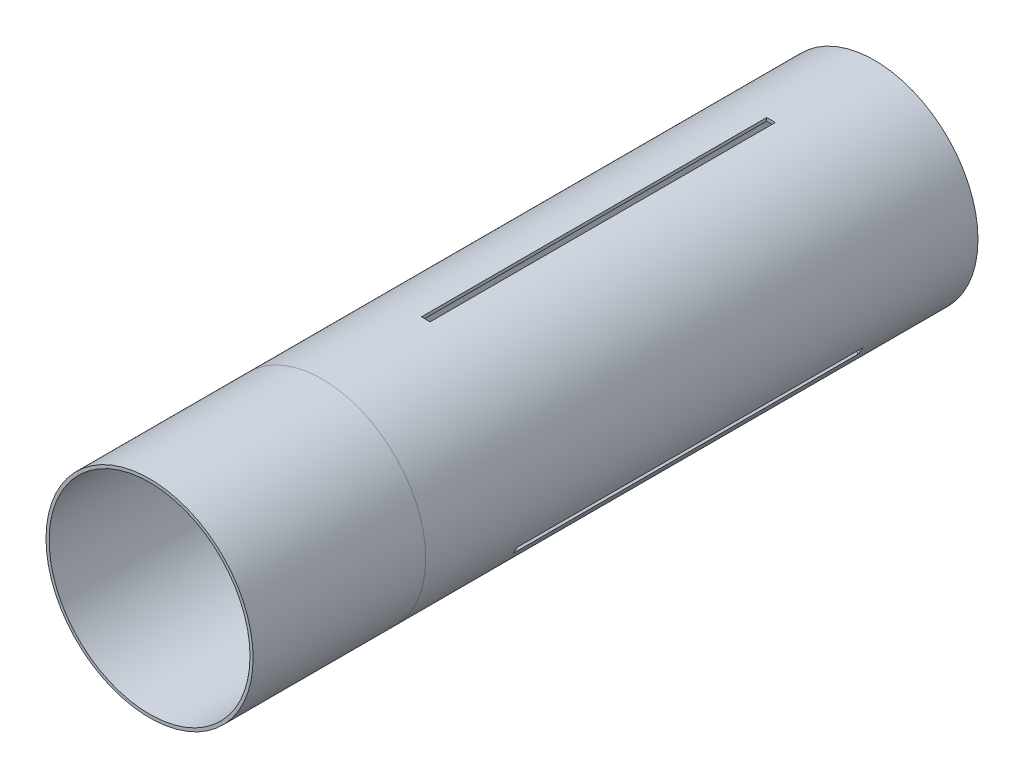
ISO-10303-21;
HEADER;
FILE_DESCRIPTION(('STEP AP214'),'2;1');
FILE_NAME('part.step','',(''),(''),'','','');
FILE_SCHEMA(('AUTOMOTIVE_DESIGN { 1 0 10303 214 1 1 1 1 }'));
ENDSEC;
DATA;
#1=APPLICATION_CONTEXT('core data for automotive mechanical design processes');
#2=APPLICATION_PROTOCOL_DEFINITION('international standard','automotive_design',2000,#1);
#3=PRODUCT_CONTEXT('',#1,'mechanical');
#4=PRODUCT('Part','Part','',(#3));
#5=PRODUCT_RELATED_PRODUCT_CATEGORY('part','',(#4));
#6=PRODUCT_DEFINITION_FORMATION('','',#4);
#7=PRODUCT_DEFINITION_CONTEXT('part definition',#1,'design');
#8=PRODUCT_DEFINITION('design','',#6,#7);
#9=PRODUCT_DEFINITION_SHAPE('','',#8);
#10=(LENGTH_UNIT() NAMED_UNIT(*) SI_UNIT(.MILLI.,.METRE.));
#11=(NAMED_UNIT(*) PLANE_ANGLE_UNIT() SI_UNIT($,.RADIAN.));
#12=(NAMED_UNIT(*) SI_UNIT($,.STERADIAN.) SOLID_ANGLE_UNIT());
#13=UNCERTAINTY_MEASURE_WITH_UNIT(LENGTH_MEASURE(1.E-05),#10,'distance_accuracy_value','');
#14=(GEOMETRIC_REPRESENTATION_CONTEXT(3) GLOBAL_UNCERTAINTY_ASSIGNED_CONTEXT((#13)) GLOBAL_UNIT_ASSIGNED_CONTEXT((#10,
#11,#12)) REPRESENTATION_CONTEXT('',''));
#15=CARTESIAN_POINT('',(0.,0.,0.));
#16=DIRECTION('',(0.,0.,1.));
#17=DIRECTION('',(1.,0.,0.));
#18=AXIS2_PLACEMENT_3D('',#15,#16,#17);
#19=CARTESIAN_POINT('',(0.,0.,0.));
#20=DIRECTION('',(0.,0.,1.));
#21=DIRECTION('',(1.,0.,0.));
#22=AXIS2_PLACEMENT_3D('',#19,#20,#21);
#23=PLANE('',#22);
#24=CARTESIAN_POINT('',(0.,0.,0.));
#25=DIRECTION('',(0.,0.,1.));
#26=DIRECTION('',(1.,0.,0.));
#27=AXIS2_PLACEMENT_3D('',#24,#25,#26);
#28=CIRCLE('',#27,76.1746);
#29=CARTESIAN_POINT('',(76.1746,0.,0.));
#30=VERTEX_POINT('',#29);
#31=EDGE_CURVE('E191',#30,#30,#28,.T.);
#32=ORIENTED_EDGE('',*,*,#31,.F.);
#33=EDGE_LOOP('',(#32));
#34=FACE_BOUND('',#33,.T.);
#35=CARTESIAN_POINT('',(0.,0.,0.));
#36=DIRECTION('',(0.,0.,1.));
#37=DIRECTION('',(1.,0.,0.));
#38=AXIS2_PLACEMENT_3D('',#35,#36,#37);
#39=CIRCLE('',#38,73.914);
#40=CARTESIAN_POINT('',(73.914,0.,0.));
#41=VERTEX_POINT('',#40);
#42=EDGE_CURVE('E186',#41,#41,#39,.T.);
#43=ORIENTED_EDGE('',*,*,#42,.T.);
#44=EDGE_LOOP('',(#43));
#45=FACE_BOUND('',#44,.T.);
#46=ADVANCED_FACE('F35',(#34,#45),#23,.F.);
#47=CARTESIAN_POINT('',(0.,0.,406.4));
#48=DIRECTION('',(0.,0.,-1.));
#49=DIRECTION('',(-1.,0.,0.));
#50=AXIS2_PLACEMENT_3D('',#47,#48,#49);
#51=CYLINDRICAL_SURFACE('',#50,76.1746);
#52=CARTESIAN_POINT('',(0.,0.,330.2));
#53=DIRECTION('',(0.,0.,1.));
#54=DIRECTION('',(1.,0.,0.));
#55=AXIS2_PLACEMENT_3D('',#52,#53,#54);
#56=CIRCLE('',#55,76.1746);
#57=CARTESIAN_POINT('',(-67.4993107407161,-35.3045710169129,330.2));
#58=VERTEX_POINT('',#57);
#59=CARTESIAN_POINT('',(-64.3243107407161,-40.8038323309441,330.2));
#60=VERTEX_POINT('',#59);
#61=EDGE_CURVE('E153',#58,#60,#56,.T.);
#62=ORIENTED_EDGE('',*,*,#61,.T.);
#63=DIRECTION('',(0.,0.,-1.));
#64=VECTOR('',#63,1.);
#65=CARTESIAN_POINT('',(-64.3243107407161,-40.8038323309441,406.4));
#66=LINE('',#65,#64);
#67=CARTESIAN_POINT('',(-64.3243107407161,-40.8038323309441,76.2));
#68=VERTEX_POINT('',#67);
#69=EDGE_CURVE('E154',#60,#68,#66,.T.);
#70=ORIENTED_EDGE('',*,*,#69,.T.);
#71=CARTESIAN_POINT('',(0.,0.,76.2));
#72=DIRECTION('',(0.,0.,1.));
#73=DIRECTION('',(1.,0.,0.));
#74=AXIS2_PLACEMENT_3D('',#71,#72,#73);
#75=CIRCLE('',#74,76.1746);
#76=CARTESIAN_POINT('',(-67.4993107407161,-35.3045710169129,76.2));
#77=VERTEX_POINT('',#76);
#78=EDGE_CURVE('E145',#77,#68,#75,.T.);
#79=ORIENTED_EDGE('',*,*,#78,.F.);
#80=DIRECTION('',(0.,0.,-1.));
#81=VECTOR('',#80,1.);
#82=CARTESIAN_POINT('',(-67.4993107407161,-35.3045710169129,406.4));
#83=LINE('',#82,#81);
#84=EDGE_CURVE('E147',#58,#77,#83,.T.);
#85=ORIENTED_EDGE('',*,*,#84,.F.);
#86=EDGE_LOOP('',(#62,#70,#79,#85));
#87=FACE_BOUND('',#86,.T.);
#88=CARTESIAN_POINT('',(64.3243107407166,-40.8038323309432,330.2));
#89=VERTEX_POINT('',#88);
#90=CARTESIAN_POINT('',(67.4993107407166,-35.304571016912,330.2));
#91=VERTEX_POINT('',#90);
#92=EDGE_CURVE('E151',#89,#91,#56,.T.);
#93=ORIENTED_EDGE('',*,*,#92,.T.);
#94=DIRECTION('',(0.,0.,-1.));
#95=VECTOR('',#94,1.);
#96=CARTESIAN_POINT('',(67.4993107407166,-35.304571016912,406.4));
#97=LINE('',#96,#95);
#98=CARTESIAN_POINT('',(67.4993107407166,-35.304571016912,76.2));
#99=VERTEX_POINT('',#98);
#100=EDGE_CURVE('E130',#91,#99,#97,.T.);
#101=ORIENTED_EDGE('',*,*,#100,.T.);
#102=CARTESIAN_POINT('',(64.3243107407166,-40.8038323309432,76.2));
#103=VERTEX_POINT('',#102);
#104=EDGE_CURVE('E136',#103,#99,#75,.T.);
#105=ORIENTED_EDGE('',*,*,#104,.F.);
#106=DIRECTION('',(0.,0.,-1.));
#107=VECTOR('',#106,1.);
#108=CARTESIAN_POINT('',(64.3243107407166,-40.8038323309432,406.4));
#109=LINE('',#108,#107);
#110=EDGE_CURVE('E122',#89,#103,#109,.T.);
#111=ORIENTED_EDGE('',*,*,#110,.F.);
#112=EDGE_LOOP('',(#93,#101,#105,#111));
#113=FACE_BOUND('',#112,.T.);
#114=CARTESIAN_POINT('',(0.,0.,330.2));
#115=DIRECTION('',(0.,0.,1.));
#116=DIRECTION('',(1.,0.,0.));
#117=AXIS2_PLACEMENT_3D('',#114,#115,#116);
#118=CIRCLE('',#117,76.1746);
#119=CARTESIAN_POINT('',(3.17500000000003,76.1084033478564,330.2));
#120=VERTEX_POINT('',#119);
#121=CARTESIAN_POINT('',(-3.175,76.1084033478564,330.2));
#122=VERTEX_POINT('',#121);
#123=EDGE_CURVE('E173',#120,#122,#118,.T.);
#124=ORIENTED_EDGE('',*,*,#123,.T.);
#125=DIRECTION('',(0.,0.,-1.));
#126=VECTOR('',#125,1.);
#127=CARTESIAN_POINT('',(-3.175,76.1084033478564,406.4));
#128=LINE('',#127,#126);
#129=CARTESIAN_POINT('',(-3.175,76.1084033478564,76.2));
#130=VERTEX_POINT('',#129);
#131=EDGE_CURVE('E176',#122,#130,#128,.T.);
#132=ORIENTED_EDGE('',*,*,#131,.T.);
#133=CARTESIAN_POINT('',(0.,0.,76.2));
#134=DIRECTION('',(0.,0.,1.));
#135=DIRECTION('',(1.,0.,0.));
#136=AXIS2_PLACEMENT_3D('',#133,#134,#135);
#137=CIRCLE('',#136,76.1746);
#138=CARTESIAN_POINT('',(3.17500000000003,76.1084033478564,76.2));
#139=VERTEX_POINT('',#138);
#140=EDGE_CURVE('E168',#139,#130,#137,.T.);
#141=ORIENTED_EDGE('',*,*,#140,.F.);
#142=DIRECTION('',(0.,0.,-1.));
#143=VECTOR('',#142,1.);
#144=CARTESIAN_POINT('',(3.17500000000003,76.1084033478564,406.4));
#145=LINE('',#144,#143);
#146=EDGE_CURVE('E170',#120,#139,#145,.T.);
#147=ORIENTED_EDGE('',*,*,#146,.F.);
#148=EDGE_LOOP('',(#124,#132,#141,#147));
#149=FACE_BOUND('',#148,.T.);
#150=CARTESIAN_POINT('',(0.,0.,406.4));
#151=DIRECTION('',(0.,0.,1.));
#152=DIRECTION('',(1.,0.,0.));
#153=AXIS2_PLACEMENT_3D('',#150,#151,#152);
#154=CIRCLE('',#153,76.1746);
#155=CARTESIAN_POINT('',(76.1746,0.,406.4));
#156=VERTEX_POINT('',#155);
#157=EDGE_CURVE('E192',#156,#156,#154,.T.);
#158=ORIENTED_EDGE('',*,*,#157,.F.);
#159=EDGE_LOOP('',(#158));
#160=FACE_BOUND('',#159,.T.);
#161=ORIENTED_EDGE('',*,*,#31,.T.);
#162=EDGE_LOOP('',(#161));
#163=FACE_BOUND('',#162,.T.);
#164=ADVANCED_FACE('F37',(#87,#113,#149,#160,#163),#51,.T.);
#165=CARTESIAN_POINT('',(0.,0.,406.4));
#166=DIRECTION('',(0.,0.,-1.));
#167=DIRECTION('',(-1.,0.,0.));
#168=AXIS2_PLACEMENT_3D('',#165,#166,#167);
#169=CYLINDRICAL_SURFACE('',#168,73.914);
#170=DIRECTION('',(0.,0.,-1.));
#171=VECTOR('',#170,1.);
#172=CARTESIAN_POINT('',(-62.3648187871243,-39.672519124063,406.4));
#173=LINE('',#172,#171);
#174=CARTESIAN_POINT('',(-62.3648187871243,-39.672519124063,330.2));
#175=VERTEX_POINT('',#174);
#176=CARTESIAN_POINT('',(-62.3648187871243,-39.672519124063,76.2));
#177=VERTEX_POINT('',#176);
#178=EDGE_CURVE('E11',#175,#177,#173,.T.);
#179=ORIENTED_EDGE('',*,*,#178,.F.);
#180=CARTESIAN_POINT('',(0.,0.,330.2));
#181=DIRECTION('',(0.,0.,1.));
#182=DIRECTION('',(1.,0.,0.));
#183=AXIS2_PLACEMENT_3D('',#180,#181,#182);
#184=CIRCLE('',#183,73.914);
#185=CARTESIAN_POINT('',(-65.5398187871244,-34.1732578100318,330.2));
#186=VERTEX_POINT('',#185);
#187=EDGE_CURVE('E43',#186,#175,#184,.T.);
#188=ORIENTED_EDGE('',*,*,#187,.F.);
#189=DIRECTION('',(0.,0.,-1.));
#190=VECTOR('',#189,1.);
#191=CARTESIAN_POINT('',(-65.5398187871244,-34.1732578100318,406.4));
#192=LINE('',#191,#190);
#193=CARTESIAN_POINT('',(-65.5398187871244,-34.1732578100318,76.2));
#194=VERTEX_POINT('',#193);
#195=EDGE_CURVE('E215',#186,#194,#192,.T.);
#196=ORIENTED_EDGE('',*,*,#195,.T.);
#197=CARTESIAN_POINT('',(0.,0.,76.2));
#198=DIRECTION('',(0.,0.,1.));
#199=DIRECTION('',(1.,0.,0.));
#200=AXIS2_PLACEMENT_3D('',#197,#198,#199);
#201=CIRCLE('',#200,73.914);
#202=EDGE_CURVE('E212',#194,#177,#201,.T.);
#203=ORIENTED_EDGE('',*,*,#202,.T.);
#204=EDGE_LOOP('',(#179,#188,#196,#203));
#205=FACE_BOUND('',#204,.T.);
#206=DIRECTION('',(0.,0.,-1.));
#207=VECTOR('',#206,1.);
#208=CARTESIAN_POINT('',(65.5398187871249,-34.1732578100309,406.4));
#209=LINE('',#208,#207);
#210=CARTESIAN_POINT('',(65.5398187871249,-34.1732578100309,330.2));
#211=VERTEX_POINT('',#210);
#212=CARTESIAN_POINT('',(65.5398187871249,-34.1732578100309,76.2));
#213=VERTEX_POINT('',#212);
#214=EDGE_CURVE('E214',#211,#213,#209,.T.);
#215=ORIENTED_EDGE('',*,*,#214,.F.);
#216=CARTESIAN_POINT('',(62.3648187871249,-39.6725191240621,330.2));
#217=VERTEX_POINT('',#216);
#218=EDGE_CURVE('E211',#217,#211,#184,.T.);
#219=ORIENTED_EDGE('',*,*,#218,.F.);
#220=DIRECTION('',(0.,0.,-1.));
#221=VECTOR('',#220,1.);
#222=CARTESIAN_POINT('',(62.3648187871249,-39.6725191240621,406.4));
#223=LINE('',#222,#221);
#224=CARTESIAN_POINT('',(62.3648187871249,-39.6725191240621,76.2));
#225=VERTEX_POINT('',#224);
#226=EDGE_CURVE('E208',#217,#225,#223,.T.);
#227=ORIENTED_EDGE('',*,*,#226,.T.);
#228=EDGE_CURVE('E139',#225,#213,#201,.T.);
#229=ORIENTED_EDGE('',*,*,#228,.T.);
#230=EDGE_LOOP('',(#215,#219,#227,#229));
#231=FACE_BOUND('',#230,.T.);
#232=DIRECTION('',(0.,0.,-1.));
#233=VECTOR('',#232,1.);
#234=CARTESIAN_POINT('',(-3.175,73.8457769340942,406.4));
#235=LINE('',#234,#233);
#236=CARTESIAN_POINT('',(-3.175,73.8457769340942,330.2));
#237=VERTEX_POINT('',#236);
#238=CARTESIAN_POINT('',(-3.175,73.8457769340942,76.2));
#239=VERTEX_POINT('',#238);
#240=EDGE_CURVE('E205',#237,#239,#235,.T.);
#241=ORIENTED_EDGE('',*,*,#240,.F.);
#242=CARTESIAN_POINT('',(0.,0.,330.2));
#243=DIRECTION('',(0.,0.,1.));
#244=DIRECTION('',(1.,0.,0.));
#245=AXIS2_PLACEMENT_3D('',#242,#243,#244);
#246=CIRCLE('',#245,73.914);
#247=CARTESIAN_POINT('',(3.17500000000003,73.8457769340942,330.2));
#248=VERTEX_POINT('',#247);
#249=EDGE_CURVE('E203',#248,#237,#246,.T.);
#250=ORIENTED_EDGE('',*,*,#249,.F.);
#251=DIRECTION('',(0.,0.,-1.));
#252=VECTOR('',#251,1.);
#253=CARTESIAN_POINT('',(3.17500000000003,73.8457769340942,406.4));
#254=LINE('',#253,#252);
#255=CARTESIAN_POINT('',(3.17500000000003,73.8457769340942,76.2));
#256=VERTEX_POINT('',#255);
#257=EDGE_CURVE('E200',#248,#256,#254,.T.);
#258=ORIENTED_EDGE('',*,*,#257,.T.);
#259=CARTESIAN_POINT('',(0.,0.,76.2));
#260=DIRECTION('',(0.,0.,1.));
#261=DIRECTION('',(1.,0.,0.));
#262=AXIS2_PLACEMENT_3D('',#259,#260,#261);
#263=CIRCLE('',#262,73.914);
#264=EDGE_CURVE('E195',#256,#239,#263,.T.);
#265=ORIENTED_EDGE('',*,*,#264,.T.);
#266=EDGE_LOOP('',(#241,#250,#258,#265));
#267=FACE_BOUND('',#266,.T.);
#268=ORIENTED_EDGE('',*,*,#42,.F.);
#269=EDGE_LOOP('',(#268));
#270=FACE_BOUND('',#269,.T.);
#271=CARTESIAN_POINT('',(0.,0.,533.4));
#272=DIRECTION('',(0.,0.,1.));
#273=DIRECTION('',(1.,0.,0.));
#274=AXIS2_PLACEMENT_3D('',#271,#272,#273);
#275=CIRCLE('',#274,73.914);
#276=CARTESIAN_POINT('',(73.914,0.,533.4));
#277=VERTEX_POINT('',#276);
#278=EDGE_CURVE('E179',#277,#277,#275,.T.);
#279=ORIENTED_EDGE('',*,*,#278,.T.);
#280=EDGE_LOOP('',(#279));
#281=FACE_BOUND('',#280,.T.);
#282=ADVANCED_FACE('F221',(#205,#231,#267,#270,#281),#169,.F.);
#283=CARTESIAN_POINT('',(0.,0.,533.4));
#284=DIRECTION('',(0.,0.,1.));
#285=DIRECTION('',(1.,0.,0.));
#286=AXIS2_PLACEMENT_3D('',#283,#284,#285);
#287=PLANE('',#286);
#288=CARTESIAN_POINT('',(0.,0.,533.4));
#289=DIRECTION('',(0.,0.,1.));
#290=DIRECTION('',(1.,0.,0.));
#291=AXIS2_PLACEMENT_3D('',#288,#289,#290);
#292=CIRCLE('',#291,76.2);
#293=CARTESIAN_POINT('',(76.2,0.,533.4));
#294=VERTEX_POINT('',#293);
#295=EDGE_CURVE('E183',#294,#294,#292,.T.);
#296=ORIENTED_EDGE('',*,*,#295,.T.);
#297=EDGE_LOOP('',(#296));
#298=FACE_BOUND('',#297,.T.);
#299=ORIENTED_EDGE('',*,*,#278,.F.);
#300=EDGE_LOOP('',(#299));
#301=FACE_BOUND('',#300,.T.);
#302=ADVANCED_FACE('F252',(#298,#301),#287,.T.);
#303=CARTESIAN_POINT('',(0.,0.,406.4));
#304=DIRECTION('',(0.,0.,1.));
#305=DIRECTION('',(1.,0.,0.));
#306=AXIS2_PLACEMENT_3D('',#303,#304,#305);
#307=PLANE('',#306);
#308=ORIENTED_EDGE('',*,*,#157,.T.);
#309=EDGE_LOOP('',(#308));
#310=FACE_BOUND('',#309,.T.);
#311=CARTESIAN_POINT('',(0.,0.,406.4));
#312=DIRECTION('',(0.,0.,1.));
#313=DIRECTION('',(1.,0.,0.));
#314=AXIS2_PLACEMENT_3D('',#311,#312,#313);
#315=CIRCLE('',#314,76.2);
#316=CARTESIAN_POINT('',(76.2,0.,406.4));
#317=VERTEX_POINT('',#316);
#318=EDGE_CURVE('E182',#317,#317,#315,.T.);
#319=ORIENTED_EDGE('',*,*,#318,.F.);
#320=EDGE_LOOP('',(#319));
#321=FACE_BOUND('',#320,.T.);
#322=ADVANCED_FACE('F264',(#310,#321),#307,.F.);
#323=CARTESIAN_POINT('',(0.,0.,533.4));
#324=DIRECTION('',(0.,0.,-1.));
#325=DIRECTION('',(-1.,0.,0.));
#326=AXIS2_PLACEMENT_3D('',#323,#324,#325);
#327=CYLINDRICAL_SURFACE('',#326,76.2);
#328=ORIENTED_EDGE('',*,*,#295,.F.);
#329=EDGE_LOOP('',(#328));
#330=FACE_BOUND('',#329,.T.);
#331=ORIENTED_EDGE('',*,*,#318,.T.);
#332=EDGE_LOOP('',(#331));
#333=FACE_BOUND('',#332,.T.);
#334=ADVANCED_FACE('F260',(#330,#333),#327,.T.);
#335=CARTESIAN_POINT('',(-3.175,96.774,0.));
#336=DIRECTION('',(-1.,0.,0.));
#337=DIRECTION('',(0.,0.,1.));
#338=AXIS2_PLACEMENT_3D('',#335,#336,#337);
#339=PLANE('',#338);
#340=DIRECTION('',(0.,-1.,0.));
#341=VECTOR('',#340,1.);
#342=CARTESIAN_POINT('',(-3.175,96.774,330.2));
#343=LINE('',#342,#341);
#344=EDGE_CURVE('E165',#122,#237,#343,.T.);
#345=ORIENTED_EDGE('',*,*,#344,.T.);
#346=ORIENTED_EDGE('',*,*,#240,.T.);
#347=DIRECTION('',(0.,-1.,0.));
#348=VECTOR('',#347,1.);
#349=CARTESIAN_POINT('',(-3.175,96.774,76.2));
#350=LINE('',#349,#348);
#351=EDGE_CURVE('E157',#130,#239,#350,.T.);
#352=ORIENTED_EDGE('',*,*,#351,.F.);
#353=ORIENTED_EDGE('',*,*,#131,.F.);
#354=EDGE_LOOP('',(#345,#346,#352,#353));
#355=FACE_BOUND('',#354,.T.);
#356=ADVANCED_FACE('F263',(#355),#339,.F.);
#357=CARTESIAN_POINT('',(0.,96.774,330.2));
#358=DIRECTION('',(0.,0.,1.));
#359=DIRECTION('',(1.,0.,0.));
#360=AXIS2_PLACEMENT_3D('',#357,#358,#359);
#361=PLANE('',#360);
#362=DIRECTION('',(0.,-1.,0.));
#363=VECTOR('',#362,1.);
#364=CARTESIAN_POINT('',(3.17500000000003,96.774,330.2));
#365=LINE('',#364,#363);
#366=EDGE_CURVE('E162',#120,#248,#365,.T.);
#367=ORIENTED_EDGE('',*,*,#366,.T.);
#368=ORIENTED_EDGE('',*,*,#249,.T.);
#369=ORIENTED_EDGE('',*,*,#344,.F.);
#370=ORIENTED_EDGE('',*,*,#123,.F.);
#371=EDGE_LOOP('',(#367,#368,#369,#370));
#372=FACE_BOUND('',#371,.T.);
#373=ADVANCED_FACE('F274',(#372),#361,.F.);
#374=CARTESIAN_POINT('',(3.17500000000003,96.774,0.));
#375=DIRECTION('',(-1.,0.,0.));
#376=DIRECTION('',(0.,0.,1.));
#377=AXIS2_PLACEMENT_3D('',#374,#375,#376);
#378=PLANE('',#377);
#379=ORIENTED_EDGE('',*,*,#146,.T.);
#380=DIRECTION('',(0.,-1.,0.));
#381=VECTOR('',#380,1.);
#382=CARTESIAN_POINT('',(3.17500000000003,96.774,76.2));
#383=LINE('',#382,#381);
#384=EDGE_CURVE('E159',#139,#256,#383,.T.);
#385=ORIENTED_EDGE('',*,*,#384,.T.);
#386=ORIENTED_EDGE('',*,*,#257,.F.);
#387=ORIENTED_EDGE('',*,*,#366,.F.);
#388=EDGE_LOOP('',(#379,#385,#386,#387));
#389=FACE_BOUND('',#388,.T.);
#390=ADVANCED_FACE('F278',(#389),#378,.T.);
#391=CARTESIAN_POINT('',(0.,96.774,76.2));
#392=DIRECTION('',(0.,0.,1.));
#393=DIRECTION('',(1.,0.,0.));
#394=AXIS2_PLACEMENT_3D('',#391,#392,#393);
#395=PLANE('',#394);
#396=ORIENTED_EDGE('',*,*,#140,.T.);
#397=ORIENTED_EDGE('',*,*,#351,.T.);
#398=ORIENTED_EDGE('',*,*,#264,.F.);
#399=ORIENTED_EDGE('',*,*,#384,.F.);
#400=EDGE_LOOP('',(#396,#397,#398,#399));
#401=FACE_BOUND('',#400,.T.);
#402=ADVANCED_FACE('F282',(#401),#395,.T.);
#403=CARTESIAN_POINT('',(85.3962424258357,-45.6373693429836,0.));
#404=DIRECTION('',(0.499999999999992,0.866025403784443,0.));
#405=DIRECTION('',(-0.866025403784443,0.499999999999992,0.));
#406=AXIS2_PLACEMENT_3D('',#403,#404,#405);
#407=PLANE('',#406);
#408=DIRECTION('',(-0.866025403784443,0.499999999999992,0.));
#409=VECTOR('',#408,1.);
#410=CARTESIAN_POINT('',(85.3962424258357,-45.6373693429836,330.2));
#411=LINE('',#410,#409);
#412=EDGE_CURVE('E235',#91,#211,#411,.T.);
#413=ORIENTED_EDGE('',*,*,#412,.T.);
#414=ORIENTED_EDGE('',*,*,#214,.T.);
#415=DIRECTION('',(-0.866025403784443,0.499999999999992,0.));
#416=VECTOR('',#415,1.);
#417=CARTESIAN_POINT('',(85.3962424258357,-45.6373693429836,76.2));
#418=LINE('',#417,#416);
#419=EDGE_CURVE('E141',#99,#213,#418,.T.);
#420=ORIENTED_EDGE('',*,*,#419,.F.);
#421=ORIENTED_EDGE('',*,*,#100,.F.);
#422=EDGE_LOOP('',(#413,#414,#420,#421));
#423=FACE_BOUND('',#422,.T.);
#424=ADVANCED_FACE('F286',(#423),#407,.F.);
#425=CARTESIAN_POINT('',(82.2212424258357,-51.1366306570149,0.));
#426=DIRECTION('',(0.499999999999992,0.866025403784443,0.));
#427=DIRECTION('',(-0.866025403784443,0.499999999999992,0.));
#428=AXIS2_PLACEMENT_3D('',#425,#426,#427);
#429=PLANE('',#428);
#430=ORIENTED_EDGE('',*,*,#110,.T.);
#431=DIRECTION('',(-0.866025403784443,0.499999999999992,0.));
#432=VECTOR('',#431,1.);
#433=CARTESIAN_POINT('',(82.2212424258357,-51.1366306570149,76.2));
#434=LINE('',#433,#432);
#435=EDGE_CURVE('E125',#103,#225,#434,.T.);
#436=ORIENTED_EDGE('',*,*,#435,.T.);
#437=ORIENTED_EDGE('',*,*,#226,.F.);
#438=DIRECTION('',(-0.866025403784443,0.499999999999992,0.));
#439=VECTOR('',#438,1.);
#440=CARTESIAN_POINT('',(82.2212424258357,-51.1366306570149,330.2));
#441=LINE('',#440,#439);
#442=EDGE_CURVE('E58',#89,#217,#441,.T.);
#443=ORIENTED_EDGE('',*,*,#442,.F.);
#444=EDGE_LOOP('',(#430,#436,#437,#443));
#445=FACE_BOUND('',#444,.T.);
#446=ADVANCED_FACE('F124',(#445),#429,.T.);
#447=CARTESIAN_POINT('',(-83.808742425835,-48.3870000000004,76.2));
#448=DIRECTION('',(0.,0.,1.));
#449=DIRECTION('',(1.,0.,0.));
#450=AXIS2_PLACEMENT_3D('',#447,#448,#449);
#451=PLANE('',#450);
#452=ORIENTED_EDGE('',*,*,#104,.T.);
#453=ORIENTED_EDGE('',*,*,#419,.T.);
#454=ORIENTED_EDGE('',*,*,#228,.F.);
#455=ORIENTED_EDGE('',*,*,#435,.F.);
#456=EDGE_LOOP('',(#452,#453,#454,#455));
#457=FACE_BOUND('',#456,.T.);
#458=ADVANCED_FACE('F134',(#457),#451,.T.);
#459=CARTESIAN_POINT('',(-83.808742425835,-48.3870000000004,330.2));
#460=DIRECTION('',(0.,0.,1.));
#461=DIRECTION('',(1.,0.,0.));
#462=AXIS2_PLACEMENT_3D('',#459,#460,#461);
#463=PLANE('',#462);
#464=ORIENTED_EDGE('',*,*,#442,.T.);
#465=ORIENTED_EDGE('',*,*,#218,.T.);
#466=ORIENTED_EDGE('',*,*,#412,.F.);
#467=ORIENTED_EDGE('',*,*,#92,.F.);
#468=EDGE_LOOP('',(#464,#465,#466,#467));
#469=FACE_BOUND('',#468,.T.);
#470=ADVANCED_FACE('F290',(#469),#463,.F.);
#471=CARTESIAN_POINT('',(-82.221242425835,-51.136630657016,0.));
#472=DIRECTION('',(0.500000000000004,-0.866025403784436,0.));
#473=DIRECTION('',(0.866025403784436,0.500000000000004,0.));
#474=AXIS2_PLACEMENT_3D('',#471,#472,#473);
#475=PLANE('',#474);
#476=DIRECTION('',(0.866025403784436,0.500000000000004,0.));
#477=VECTOR('',#476,1.);
#478=CARTESIAN_POINT('',(-82.221242425835,-51.136630657016,330.2));
#479=LINE('',#478,#477);
#480=EDGE_CURVE('E131',#60,#175,#479,.T.);
#481=ORIENTED_EDGE('',*,*,#480,.T.);
#482=ORIENTED_EDGE('',*,*,#178,.T.);
#483=DIRECTION('',(0.866025403784436,0.500000000000004,0.));
#484=VECTOR('',#483,1.);
#485=CARTESIAN_POINT('',(-82.221242425835,-51.136630657016,76.2));
#486=LINE('',#485,#484);
#487=EDGE_CURVE('E225',#68,#177,#486,.T.);
#488=ORIENTED_EDGE('',*,*,#487,.F.);
#489=ORIENTED_EDGE('',*,*,#69,.F.);
#490=EDGE_LOOP('',(#481,#482,#488,#489));
#491=FACE_BOUND('',#490,.T.);
#492=ADVANCED_FACE('F242',(#491),#475,.F.);
#493=DIRECTION('',(0.866025403784436,0.500000000000004,0.));
#494=VECTOR('',#493,1.);
#495=CARTESIAN_POINT('',(-85.3962424258351,-45.6373693429848,330.2));
#496=LINE('',#495,#494);
#497=EDGE_CURVE('E232',#58,#186,#496,.T.);
#498=ORIENTED_EDGE('',*,*,#497,.T.);
#499=ORIENTED_EDGE('',*,*,#187,.T.);
#500=ORIENTED_EDGE('',*,*,#480,.F.);
#501=ORIENTED_EDGE('',*,*,#61,.F.);
#502=EDGE_LOOP('',(#498,#499,#500,#501));
#503=FACE_BOUND('',#502,.T.);
#504=ADVANCED_FACE('F245',(#503),#463,.F.);
#505=CARTESIAN_POINT('',(-85.3962424258351,-45.6373693429848,0.));
#506=DIRECTION('',(0.500000000000004,-0.866025403784436,0.));
#507=DIRECTION('',(0.866025403784436,0.500000000000004,0.));
#508=AXIS2_PLACEMENT_3D('',#505,#506,#507);
#509=PLANE('',#508);
#510=ORIENTED_EDGE('',*,*,#84,.T.);
#511=DIRECTION('',(0.866025403784436,0.500000000000004,0.));
#512=VECTOR('',#511,1.);
#513=CARTESIAN_POINT('',(-85.3962424258351,-45.6373693429848,76.2));
#514=LINE('',#513,#512);
#515=EDGE_CURVE('E50',#77,#194,#514,.T.);
#516=ORIENTED_EDGE('',*,*,#515,.T.);
#517=ORIENTED_EDGE('',*,*,#195,.F.);
#518=ORIENTED_EDGE('',*,*,#497,.F.);
#519=EDGE_LOOP('',(#510,#516,#517,#518));
#520=FACE_BOUND('',#519,.T.);
#521=ADVANCED_FACE('F227',(#520),#509,.T.);
#522=ORIENTED_EDGE('',*,*,#78,.T.);
#523=ORIENTED_EDGE('',*,*,#487,.T.);
#524=ORIENTED_EDGE('',*,*,#202,.F.);
#525=ORIENTED_EDGE('',*,*,#515,.F.);
#526=EDGE_LOOP('',(#522,#523,#524,#525));
#527=FACE_BOUND('',#526,.T.);
#528=ADVANCED_FACE('F223',(#527),#451,.T.);
#529=CLOSED_SHELL('',(#46,#164,#282,#302,#322,#334,#356,#373,#390,#402,#424,#446,#458,#470,#492,
#504,#521,#528));
#530=MANIFOLD_SOLID_BREP('B2',#529);
#531=ADVANCED_BREP_SHAPE_REPRESENTATION('',(#18,#530),#14);
#532=SHAPE_DEFINITION_REPRESENTATION(#9,#531);
ENDSEC;
END-ISO-10303-21;
